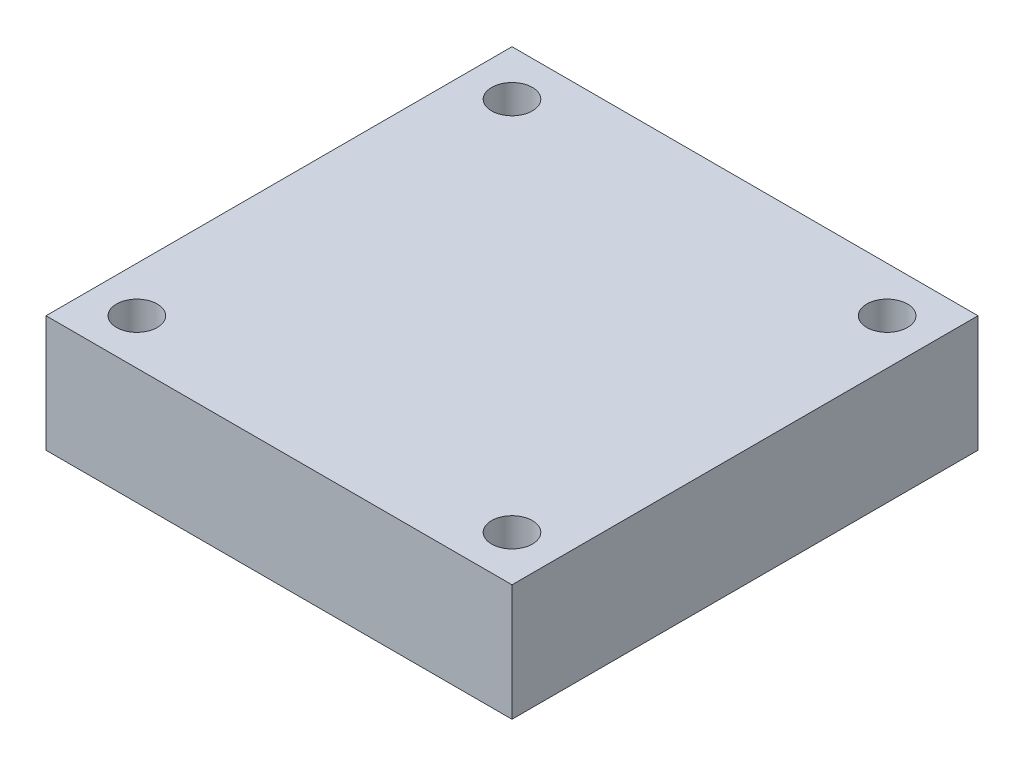
ISO-10303-21;
HEADER;
FILE_DESCRIPTION(('STEP AP214'),'2;1');
FILE_NAME('part.step','',(''),(''),'','','');
FILE_SCHEMA(('AUTOMOTIVE_DESIGN { 1 0 10303 214 1 1 1 1 }'));
ENDSEC;
DATA;
#1=APPLICATION_CONTEXT('core data for automotive mechanical design processes');
#2=APPLICATION_PROTOCOL_DEFINITION('international standard','automotive_design',2000,#1);
#3=PRODUCT_CONTEXT('',#1,'mechanical');
#4=PRODUCT('Part','Part','',(#3));
#5=PRODUCT_RELATED_PRODUCT_CATEGORY('part','',(#4));
#6=PRODUCT_DEFINITION_FORMATION('','',#4);
#7=PRODUCT_DEFINITION_CONTEXT('part definition',#1,'design');
#8=PRODUCT_DEFINITION('design','',#6,#7);
#9=PRODUCT_DEFINITION_SHAPE('','',#8);
#10=(LENGTH_UNIT() NAMED_UNIT(*) SI_UNIT(.MILLI.,.METRE.));
#11=(NAMED_UNIT(*) PLANE_ANGLE_UNIT() SI_UNIT($,.RADIAN.));
#12=(NAMED_UNIT(*) SI_UNIT($,.STERADIAN.) SOLID_ANGLE_UNIT());
#13=UNCERTAINTY_MEASURE_WITH_UNIT(LENGTH_MEASURE(1.E-05),#10,'distance_accuracy_value','');
#14=(GEOMETRIC_REPRESENTATION_CONTEXT(3) GLOBAL_UNCERTAINTY_ASSIGNED_CONTEXT((#13)) GLOBAL_UNIT_ASSIGNED_CONTEXT((#10,
#11,#12)) REPRESENTATION_CONTEXT('',''));
#15=CARTESIAN_POINT('',(0.,0.,0.));
#16=DIRECTION('',(0.,0.,1.));
#17=DIRECTION('',(1.,0.,0.));
#18=AXIS2_PLACEMENT_3D('',#15,#16,#17);
#19=CARTESIAN_POINT('',(0.,10.,0.));
#20=DIRECTION('',(1.,0.,0.));
#21=DIRECTION('',(0.,0.,-1.));
#22=AXIS2_PLACEMENT_3D('',#19,#20,#21);
#23=PLANE('',#22);
#24=DIRECTION('',(0.,0.,1.));
#25=VECTOR('',#24,1.);
#26=CARTESIAN_POINT('',(0.,0.,0.));
#27=LINE('',#26,#25);
#28=CARTESIAN_POINT('',(0.,0.,0.));
#29=VERTEX_POINT('',#28);
#30=CARTESIAN_POINT('',(0.,0.,40.));
#31=VERTEX_POINT('',#30);
#32=EDGE_CURVE('E96',#29,#31,#27,.T.);
#33=ORIENTED_EDGE('',*,*,#32,.T.);
#34=DIRECTION('',(0.,-1.,0.));
#35=VECTOR('',#34,1.);
#36=CARTESIAN_POINT('',(0.,10.,40.));
#37=LINE('',#36,#35);
#38=CARTESIAN_POINT('',(0.,10.,40.));
#39=VERTEX_POINT('',#38);
#40=EDGE_CURVE('E11',#39,#31,#37,.T.);
#41=ORIENTED_EDGE('',*,*,#40,.F.);
#42=DIRECTION('',(0.,0.,1.));
#43=VECTOR('',#42,1.);
#44=CARTESIAN_POINT('',(0.,10.,0.));
#45=LINE('',#44,#43);
#46=CARTESIAN_POINT('',(0.,10.,0.));
#47=VERTEX_POINT('',#46);
#48=EDGE_CURVE('E84',#47,#39,#45,.T.);
#49=ORIENTED_EDGE('',*,*,#48,.F.);
#50=DIRECTION('',(0.,-1.,0.));
#51=VECTOR('',#50,1.);
#52=CARTESIAN_POINT('',(0.,10.,0.));
#53=LINE('',#52,#51);
#54=EDGE_CURVE('E92',#47,#29,#53,.T.);
#55=ORIENTED_EDGE('',*,*,#54,.T.);
#56=EDGE_LOOP('',(#33,#41,#49,#55));
#57=FACE_BOUND('',#56,.T.);
#58=ADVANCED_FACE('F33',(#57),#23,.F.);
#59=CARTESIAN_POINT('',(0.,10.,40.));
#60=DIRECTION('',(0.,0.,-1.));
#61=DIRECTION('',(-1.,0.,0.));
#62=AXIS2_PLACEMENT_3D('',#59,#60,#61);
#63=PLANE('',#62);
#64=DIRECTION('',(1.,0.,0.));
#65=VECTOR('',#64,1.);
#66=CARTESIAN_POINT('',(0.,0.,40.));
#67=LINE('',#66,#65);
#68=CARTESIAN_POINT('',(40.,0.,40.));
#69=VERTEX_POINT('',#68);
#70=EDGE_CURVE('E88',#31,#69,#67,.T.);
#71=ORIENTED_EDGE('',*,*,#70,.T.);
#72=DIRECTION('',(0.,-1.,0.));
#73=VECTOR('',#72,1.);
#74=CARTESIAN_POINT('',(40.,10.,40.));
#75=LINE('',#74,#73);
#76=CARTESIAN_POINT('',(40.,10.,40.));
#77=VERTEX_POINT('',#76);
#78=EDGE_CURVE('E41',#77,#69,#75,.T.);
#79=ORIENTED_EDGE('',*,*,#78,.F.);
#80=DIRECTION('',(1.,0.,0.));
#81=VECTOR('',#80,1.);
#82=CARTESIAN_POINT('',(0.,10.,40.));
#83=LINE('',#82,#81);
#84=EDGE_CURVE('E79',#39,#77,#83,.T.);
#85=ORIENTED_EDGE('',*,*,#84,.F.);
#86=ORIENTED_EDGE('',*,*,#40,.T.);
#87=EDGE_LOOP('',(#71,#79,#85,#86));
#88=FACE_BOUND('',#87,.T.);
#89=ADVANCED_FACE('F87',(#88),#63,.F.);
#90=CARTESIAN_POINT('',(40.,10.,0.));
#91=DIRECTION('',(-1.,0.,0.));
#92=DIRECTION('',(0.,0.,1.));
#93=AXIS2_PLACEMENT_3D('',#90,#91,#92);
#94=PLANE('',#93);
#95=DIRECTION('',(0.,0.,-1.));
#96=VECTOR('',#95,1.);
#97=CARTESIAN_POINT('',(40.,0.,0.));
#98=LINE('',#97,#96);
#99=CARTESIAN_POINT('',(40.,0.,0.));
#100=VERTEX_POINT('',#99);
#101=EDGE_CURVE('E66',#69,#100,#98,.T.);
#102=ORIENTED_EDGE('',*,*,#101,.T.);
#103=DIRECTION('',(0.,-1.,0.));
#104=VECTOR('',#103,1.);
#105=CARTESIAN_POINT('',(40.,10.,0.));
#106=LINE('',#105,#104);
#107=CARTESIAN_POINT('',(40.,10.,0.));
#108=VERTEX_POINT('',#107);
#109=EDGE_CURVE('E89',#108,#100,#106,.T.);
#110=ORIENTED_EDGE('',*,*,#109,.F.);
#111=DIRECTION('',(0.,0.,-1.));
#112=VECTOR('',#111,1.);
#113=CARTESIAN_POINT('',(40.,10.,0.));
#114=LINE('',#113,#112);
#115=EDGE_CURVE('E82',#77,#108,#114,.T.);
#116=ORIENTED_EDGE('',*,*,#115,.F.);
#117=ORIENTED_EDGE('',*,*,#78,.T.);
#118=EDGE_LOOP('',(#102,#110,#116,#117));
#119=FACE_BOUND('',#118,.T.);
#120=ADVANCED_FACE('F90',(#119),#94,.F.);
#121=CARTESIAN_POINT('',(0.,10.,0.));
#122=DIRECTION('',(0.,0.,1.));
#123=DIRECTION('',(1.,0.,0.));
#124=AXIS2_PLACEMENT_3D('',#121,#122,#123);
#125=PLANE('',#124);
#126=DIRECTION('',(-1.,0.,0.));
#127=VECTOR('',#126,1.);
#128=CARTESIAN_POINT('',(0.,0.,0.));
#129=LINE('',#128,#127);
#130=EDGE_CURVE('E72',#100,#29,#129,.T.);
#131=ORIENTED_EDGE('',*,*,#130,.T.);
#132=ORIENTED_EDGE('',*,*,#54,.F.);
#133=DIRECTION('',(-1.,0.,0.));
#134=VECTOR('',#133,1.);
#135=CARTESIAN_POINT('',(0.,10.,0.));
#136=LINE('',#135,#134);
#137=EDGE_CURVE('E49',#108,#47,#136,.T.);
#138=ORIENTED_EDGE('',*,*,#137,.F.);
#139=ORIENTED_EDGE('',*,*,#109,.T.);
#140=EDGE_LOOP('',(#131,#132,#138,#139));
#141=FACE_BOUND('',#140,.T.);
#142=ADVANCED_FACE('F104',(#141),#125,.F.);
#143=CARTESIAN_POINT('',(0.,10.,0.));
#144=DIRECTION('',(0.,1.,0.));
#145=DIRECTION('',(0.,0.,1.));
#146=AXIS2_PLACEMENT_3D('',#143,#144,#145);
#147=PLANE('',#146);
#148=CARTESIAN_POINT('',(36.1,10.,3.9));
#149=DIRECTION('',(0.,1.,0.));
#150=DIRECTION('',(0.,0.,1.));
#151=AXIS2_PLACEMENT_3D('',#148,#149,#150);
#152=CIRCLE('',#151,1.75);
#153=CARTESIAN_POINT('',(36.1,10.,5.65));
#154=VERTEX_POINT('',#153);
#155=EDGE_CURVE('E128',#154,#154,#152,.T.);
#156=ORIENTED_EDGE('',*,*,#155,.F.);
#157=EDGE_LOOP('',(#156));
#158=FACE_BOUND('',#157,.T.);
#159=CARTESIAN_POINT('',(36.1000000000003,10.,36.1));
#160=DIRECTION('',(0.,1.,0.));
#161=DIRECTION('',(0.,0.,1.));
#162=AXIS2_PLACEMENT_3D('',#159,#160,#161);
#163=CIRCLE('',#162,1.75);
#164=CARTESIAN_POINT('',(36.1000000000003,10.,37.85));
#165=VERTEX_POINT('',#164);
#166=EDGE_CURVE('E122',#165,#165,#163,.T.);
#167=ORIENTED_EDGE('',*,*,#166,.F.);
#168=EDGE_LOOP('',(#167));
#169=FACE_BOUND('',#168,.T.);
#170=CARTESIAN_POINT('',(3.90000000000034,10.,36.1));
#171=DIRECTION('',(0.,1.,0.));
#172=DIRECTION('',(0.,0.,1.));
#173=AXIS2_PLACEMENT_3D('',#170,#171,#172);
#174=CIRCLE('',#173,1.75);
#175=CARTESIAN_POINT('',(3.90000000000034,10.,37.85));
#176=VERTEX_POINT('',#175);
#177=EDGE_CURVE('E116',#176,#176,#174,.T.);
#178=ORIENTED_EDGE('',*,*,#177,.F.);
#179=EDGE_LOOP('',(#178));
#180=FACE_BOUND('',#179,.T.);
#181=CARTESIAN_POINT('',(3.9,10.,3.9));
#182=DIRECTION('',(0.,1.,0.));
#183=DIRECTION('',(0.,0.,1.));
#184=AXIS2_PLACEMENT_3D('',#181,#182,#183);
#185=CIRCLE('',#184,1.75);
#186=CARTESIAN_POINT('',(3.9,10.,5.65));
#187=VERTEX_POINT('',#186);
#188=EDGE_CURVE('E110',#187,#187,#185,.T.);
#189=ORIENTED_EDGE('',*,*,#188,.F.);
#190=EDGE_LOOP('',(#189));
#191=FACE_BOUND('',#190,.T.);
#192=ORIENTED_EDGE('',*,*,#48,.T.);
#193=ORIENTED_EDGE('',*,*,#84,.T.);
#194=ORIENTED_EDGE('',*,*,#115,.T.);
#195=ORIENTED_EDGE('',*,*,#137,.T.);
#196=EDGE_LOOP('',(#192,#193,#194,#195));
#197=FACE_BOUND('',#196,.T.);
#198=ADVANCED_FACE('F80',(#158,#169,#180,#191,#197),#147,.T.);
#199=CARTESIAN_POINT('',(0.,0.,0.));
#200=DIRECTION('',(0.,1.,0.));
#201=DIRECTION('',(0.,0.,1.));
#202=AXIS2_PLACEMENT_3D('',#199,#200,#201);
#203=PLANE('',#202);
#204=CARTESIAN_POINT('',(36.1,0.,3.9));
#205=DIRECTION('',(0.,1.,0.));
#206=DIRECTION('',(0.,0.,1.));
#207=AXIS2_PLACEMENT_3D('',#204,#205,#206);
#208=CIRCLE('',#207,1.75);
#209=CARTESIAN_POINT('',(36.1,0.,5.65));
#210=VERTEX_POINT('',#209);
#211=EDGE_CURVE('E113',#210,#210,#208,.T.);
#212=ORIENTED_EDGE('',*,*,#211,.T.);
#213=EDGE_LOOP('',(#212));
#214=FACE_BOUND('',#213,.T.);
#215=CARTESIAN_POINT('',(36.1000000000003,0.,36.1));
#216=DIRECTION('',(0.,1.,0.));
#217=DIRECTION('',(0.,0.,1.));
#218=AXIS2_PLACEMENT_3D('',#215,#216,#217);
#219=CIRCLE('',#218,1.75);
#220=CARTESIAN_POINT('',(36.1000000000003,0.,37.85));
#221=VERTEX_POINT('',#220);
#222=EDGE_CURVE('E125',#221,#221,#219,.T.);
#223=ORIENTED_EDGE('',*,*,#222,.T.);
#224=EDGE_LOOP('',(#223));
#225=FACE_BOUND('',#224,.T.);
#226=CARTESIAN_POINT('',(3.90000000000034,0.,36.1));
#227=DIRECTION('',(0.,1.,0.));
#228=DIRECTION('',(0.,0.,1.));
#229=AXIS2_PLACEMENT_3D('',#226,#227,#228);
#230=CIRCLE('',#229,1.75);
#231=CARTESIAN_POINT('',(3.90000000000034,0.,37.85));
#232=VERTEX_POINT('',#231);
#233=EDGE_CURVE('E119',#232,#232,#230,.T.);
#234=ORIENTED_EDGE('',*,*,#233,.T.);
#235=EDGE_LOOP('',(#234));
#236=FACE_BOUND('',#235,.T.);
#237=CARTESIAN_POINT('',(3.9,0.,3.9));
#238=DIRECTION('',(0.,1.,0.));
#239=DIRECTION('',(0.,0.,1.));
#240=AXIS2_PLACEMENT_3D('',#237,#238,#239);
#241=CIRCLE('',#240,1.75);
#242=CARTESIAN_POINT('',(3.9,0.,5.65));
#243=VERTEX_POINT('',#242);
#244=EDGE_CURVE('E99',#243,#243,#241,.T.);
#245=ORIENTED_EDGE('',*,*,#244,.T.);
#246=EDGE_LOOP('',(#245));
#247=FACE_BOUND('',#246,.T.);
#248=ORIENTED_EDGE('',*,*,#32,.F.);
#249=ORIENTED_EDGE('',*,*,#130,.F.);
#250=ORIENTED_EDGE('',*,*,#101,.F.);
#251=ORIENTED_EDGE('',*,*,#70,.F.);
#252=EDGE_LOOP('',(#248,#249,#250,#251));
#253=FACE_BOUND('',#252,.T.);
#254=ADVANCED_FACE('F107',(#214,#225,#236,#247,#253),#203,.F.);
#255=CARTESIAN_POINT('',(3.9,0.,3.9));
#256=DIRECTION('',(0.,1.,0.));
#257=DIRECTION('',(0.,0.,1.));
#258=AXIS2_PLACEMENT_3D('',#255,#256,#257);
#259=CYLINDRICAL_SURFACE('',#258,1.75);
#260=ORIENTED_EDGE('',*,*,#244,.F.);
#261=EDGE_LOOP('',(#260));
#262=FACE_BOUND('',#261,.T.);
#263=ORIENTED_EDGE('',*,*,#188,.T.);
#264=EDGE_LOOP('',(#263));
#265=FACE_BOUND('',#264,.T.);
#266=ADVANCED_FACE('F152',(#262,#265),#259,.F.);
#267=CARTESIAN_POINT('',(3.90000000000034,0.,36.1));
#268=DIRECTION('',(0.,1.,0.));
#269=DIRECTION('',(0.,0.,1.));
#270=AXIS2_PLACEMENT_3D('',#267,#268,#269);
#271=CYLINDRICAL_SURFACE('',#270,1.75);
#272=ORIENTED_EDGE('',*,*,#233,.F.);
#273=EDGE_LOOP('',(#272));
#274=FACE_BOUND('',#273,.T.);
#275=ORIENTED_EDGE('',*,*,#177,.T.);
#276=EDGE_LOOP('',(#275));
#277=FACE_BOUND('',#276,.T.);
#278=ADVANCED_FACE('F154',(#274,#277),#271,.F.);
#279=CARTESIAN_POINT('',(36.1000000000003,0.,36.1));
#280=DIRECTION('',(0.,1.,0.));
#281=DIRECTION('',(0.,0.,1.));
#282=AXIS2_PLACEMENT_3D('',#279,#280,#281);
#283=CYLINDRICAL_SURFACE('',#282,1.75);
#284=ORIENTED_EDGE('',*,*,#222,.F.);
#285=EDGE_LOOP('',(#284));
#286=FACE_BOUND('',#285,.T.);
#287=ORIENTED_EDGE('',*,*,#166,.T.);
#288=EDGE_LOOP('',(#287));
#289=FACE_BOUND('',#288,.T.);
#290=ADVANCED_FACE('F139',(#286,#289),#283,.F.);
#291=CARTESIAN_POINT('',(36.1,0.,3.9));
#292=DIRECTION('',(0.,1.,0.));
#293=DIRECTION('',(0.,0.,1.));
#294=AXIS2_PLACEMENT_3D('',#291,#292,#293);
#295=CYLINDRICAL_SURFACE('',#294,1.75);
#296=ORIENTED_EDGE('',*,*,#211,.F.);
#297=EDGE_LOOP('',(#296));
#298=FACE_BOUND('',#297,.T.);
#299=ORIENTED_EDGE('',*,*,#155,.T.);
#300=EDGE_LOOP('',(#299));
#301=FACE_BOUND('',#300,.T.);
#302=ADVANCED_FACE('F136',(#298,#301),#295,.F.);
#303=CLOSED_SHELL('',(#58,#89,#120,#142,#198,#254,#266,#278,#290,#302));
#304=MANIFOLD_SOLID_BREP('B2',#303);
#305=ADVANCED_BREP_SHAPE_REPRESENTATION('',(#18,#304),#14);
#306=SHAPE_DEFINITION_REPRESENTATION(#9,#305);
ENDSEC;
END-ISO-10303-21;
